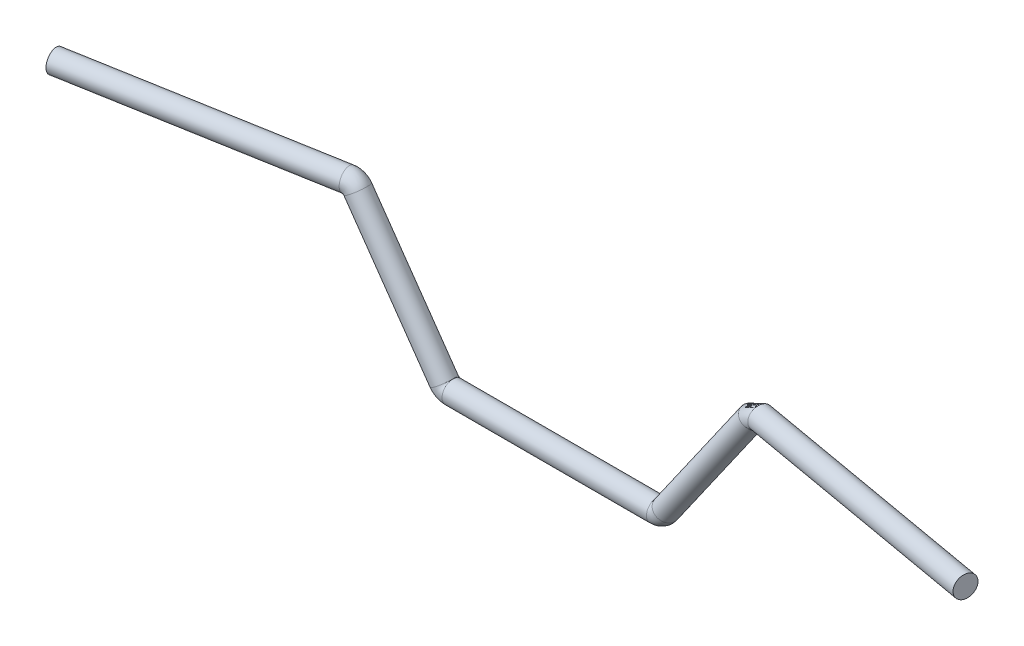
ISO-10303-21;
HEADER;
FILE_DESCRIPTION(('STEP AP214'),'2;1');
FILE_NAME('part.step','',(''),(''),'','','');
FILE_SCHEMA(('AUTOMOTIVE_DESIGN { 1 0 10303 214 1 1 1 1 }'));
ENDSEC;
DATA;
#1=APPLICATION_CONTEXT('core data for automotive mechanical design processes');
#2=APPLICATION_PROTOCOL_DEFINITION('international standard','automotive_design',2000,#1);
#3=PRODUCT_CONTEXT('',#1,'mechanical');
#4=PRODUCT('Part','Part','',(#3));
#5=PRODUCT_RELATED_PRODUCT_CATEGORY('part','',(#4));
#6=PRODUCT_DEFINITION_FORMATION('','',#4);
#7=PRODUCT_DEFINITION_CONTEXT('part definition',#1,'design');
#8=PRODUCT_DEFINITION('design','',#6,#7);
#9=PRODUCT_DEFINITION_SHAPE('','',#8);
#10=(LENGTH_UNIT() NAMED_UNIT(*) SI_UNIT(.MILLI.,.METRE.));
#11=(NAMED_UNIT(*) PLANE_ANGLE_UNIT() SI_UNIT($,.RADIAN.));
#12=(NAMED_UNIT(*) SI_UNIT($,.STERADIAN.) SOLID_ANGLE_UNIT());
#13=UNCERTAINTY_MEASURE_WITH_UNIT(LENGTH_MEASURE(1.E-05),#10,'distance_accuracy_value','');
#14=(GEOMETRIC_REPRESENTATION_CONTEXT(3) GLOBAL_UNCERTAINTY_ASSIGNED_CONTEXT((#13)) GLOBAL_UNIT_ASSIGNED_CONTEXT((#10,
#11,#12)) REPRESENTATION_CONTEXT('',''));
#15=CARTESIAN_POINT('',(0.,0.,0.));
#16=DIRECTION('',(0.,0.,1.));
#17=DIRECTION('',(1.,0.,0.));
#18=AXIS2_PLACEMENT_3D('',#15,#16,#17);
#19=CARTESIAN_POINT('',(422.390326175586,122.872806643351,41.6755626400692));
#20=DIRECTION('',(0.984807753012204,0.,0.173648177666956));
#21=DIRECTION('',(0.173648177666956,0.,-0.984807753012203));
#22=AXIS2_PLACEMENT_3D('',#19,#20,#21);
#23=PLANE('',#22);
#24=CARTESIAN_POINT('',(422.390326175586,122.872806643351,41.6755626400692));
#25=DIRECTION('',(0.984807753012204,0.,0.173648177666956));
#26=DIRECTION('',(0.173648177666956,0.,-0.984807753012203));
#27=AXIS2_PLACEMENT_3D('',#24,#25,#26);
#28=CIRCLE('',#27,10.);
#29=CARTESIAN_POINT('',(424.126807952255,122.872806643351,31.8274851099472));
#30=VERTEX_POINT('',#29);
#31=EDGE_CURVE('E58',#30,#30,#28,.T.);
#32=ORIENTED_EDGE('',*,*,#31,.T.);
#33=EDGE_LOOP('',(#32));
#34=FACE_BOUND('',#33,.T.);
#35=ADVANCED_FACE('F46',(#34),#23,.T.);
#36=CARTESIAN_POINT('',(-422.390326175587,122.872806643349,41.6755626400633));
#37=DIRECTION('',(0.984807753012208,0.,-0.17364817766693));
#38=DIRECTION('',(-0.17364817766693,0.,-0.984807753012208));
#39=AXIS2_PLACEMENT_3D('',#36,#37,#38);
#40=PLANE('',#39);
#41=CARTESIAN_POINT('',(-422.390326175587,122.872806643349,41.6755626400633));
#42=DIRECTION('',(0.984807753012208,0.,-0.17364817766693));
#43=DIRECTION('',(-0.17364817766693,0.,-0.984807753012208));
#44=AXIS2_PLACEMENT_3D('',#41,#42,#43);
#45=CIRCLE('',#44,10.);
#46=CARTESIAN_POINT('',(-424.126807952257,122.872806643349,31.8274851099412));
#47=VERTEX_POINT('',#46);
#48=EDGE_CURVE('E12',#47,#47,#45,.T.);
#49=ORIENTED_EDGE('',*,*,#48,.F.);
#50=EDGE_LOOP('',(#49));
#51=FACE_BOUND('',#50,.T.);
#52=ADVANCED_FACE('F102',(#51),#40,.F.);
#53=CARTESIAN_POINT('',(422.390326175586,122.872806643351,41.6755626400692));
#54=DIRECTION('',(-0.984807753012204,0.,-0.173648177666956));
#55=DIRECTION('',(-0.173648177666956,0.,0.984807753012204));
#56=AXIS2_PLACEMENT_3D('',#53,#54,#55);
#57=CYLINDRICAL_SURFACE('',#56,10.);
#58=CARTESIAN_POINT('',(191.229564545639,122.87280664335,0.915683483585339));
#59=DIRECTION('',(0.984807753012204,0.,0.173648177666956));
#60=DIRECTION('',(0.173648177666956,0.,-0.984807753012203));
#61=AXIS2_PLACEMENT_3D('',#58,#59,#60);
#62=CIRCLE('',#61,10.);
#63=CARTESIAN_POINT('',(191.019969785401,112.945917331919,2.10435443682254));
#64=VERTEX_POINT('',#63);
#65=EDGE_CURVE('E97',#64,#64,#62,.T.);
#66=ORIENTED_EDGE('',*,*,#65,.T.);
#67=EDGE_LOOP('',(#66));
#68=FACE_BOUND('',#67,.T.);
#69=ORIENTED_EDGE('',*,*,#31,.F.);
#70=EDGE_LOOP('',(#69));
#71=FACE_BOUND('',#70,.T.);
#72=ADVANCED_FACE('F106',(#68,#71),#57,.T.);
#73=CARTESIAN_POINT('',(191.019969785401,112.945917331919,2.10435443682254));
#74=DIRECTION('',(-0.172378623883165,0.120700811869206,0.977607755719164));
#75=DIRECTION('',(0.984807753012204,0.,0.173648177666956));
#76=AXIS2_PLACEMENT_3D('',#73,#74,#75);
#77=TOROIDAL_SURFACE('',#76,10.,10.);
#78=CARTESIAN_POINT('',(183.011875869299,118.553245058664,1.73472347597681E-13));
#79=DIRECTION('',(0.573576436351043,0.819152044288994,0.));
#80=DIRECTION('',(0.074460008174665,-0.0521374590190554,-0.995860127000607));
#81=AXIS2_PLACEMENT_3D('',#78,#79,#80);
#82=CIRCLE('',#81,10.);
#83=EDGE_CURVE('E94',#64,#64,#82,.T.);
#84=ORIENTED_EDGE('',*,*,#83,.T.);
#85=ORIENTED_EDGE('',*,*,#65,.F.);
#86=EDGE_LOOP('',(#84,#85));
#87=FACE_BOUND('',#86,.T.);
#88=ADVANCED_FACE('F135',(#87),#77,.T.);
#89=CARTESIAN_POINT('',(183.011875869299,118.553245058664,0.));
#90=DIRECTION('',(-0.573576436351044,-0.819152044288993,0.));
#91=DIRECTION('',(0.819152044288993,-0.573576436351044,0.));
#92=AXIS2_PLACEMENT_3D('',#89,#90,#91);
#93=CYLINDRICAL_SURFACE('',#92,10.);
#94=CARTESIAN_POINT('',(102.985849937372,4.26423563648953,0.));
#95=DIRECTION('',(0.573576436351044,0.819152044288993,0.));
#96=DIRECTION('',(0.0744600081746643,-0.0521374590190564,-0.995860127000607));
#97=AXIS2_PLACEMENT_3D('',#94,#95,#96);
#98=CIRCLE('',#97,10.);
#99=CARTESIAN_POINT('',(94.7943294944826,10.,0.));
#100=VERTEX_POINT('',#99);
#101=EDGE_CURVE('E91',#100,#100,#98,.T.);
#102=ORIENTED_EDGE('',*,*,#101,.T.);
#103=EDGE_LOOP('',(#102));
#104=FACE_BOUND('',#103,.T.);
#105=ORIENTED_EDGE('',*,*,#83,.F.);
#106=EDGE_LOOP('',(#105));
#107=FACE_BOUND('',#106,.T.);
#108=ADVANCED_FACE('F131',(#104,#107),#93,.T.);
#109=CARTESIAN_POINT('',(84.7943294944826,10.,0.));
#110=DIRECTION('',(0.,-1.,0.));
#111=DIRECTION('',(-1.,0.,0.));
#112=AXIS2_PLACEMENT_3D('',#109,#110,#111);
#113=CIRCLE('',#112,10.);
#114=TRIMMED_CURVE('',#113,(PARAMETER_VALUE(-3.14159257062364)),
(PARAMETER_VALUE(3.14159257062364)),.T.,.PARAMETER.);
#115=CARTESIAN_POINT('',(94.7943294944826,10.,0.));
#116=DIRECTION('',(0.,0.,-1.));
#117=AXIS1_PLACEMENT('',#115,#116);
#118=SURFACE_OF_REVOLUTION('',#114,#117);
#119=CARTESIAN_POINT('',(94.7943294944825,0.,0.));
#120=DIRECTION('',(1.,0.,0.));
#121=DIRECTION('',(0.,-0.0908988858586004,-0.995860127000607));
#122=AXIS2_PLACEMENT_3D('',#119,#120,#121);
#123=CIRCLE('',#122,10.);
#124=EDGE_CURVE('E88',#100,#100,#123,.T.);
#125=ORIENTED_EDGE('',*,*,#124,.T.);
#126=ORIENTED_EDGE('',*,*,#101,.F.);
#127=EDGE_LOOP('',(#125,#126));
#128=FACE_BOUND('',#127,.T.);
#129=ADVANCED_FACE('F127',(#128),#118,.T.);
#130=CARTESIAN_POINT('',(94.7943294944825,0.,0.));
#131=DIRECTION('',(-1.,0.,0.));
#132=DIRECTION('',(0.,0.,1.));
#133=AXIS2_PLACEMENT_3D('',#130,#131,#132);
#134=CYLINDRICAL_SURFACE('',#133,10.);
#135=CARTESIAN_POINT('',(-94.7943294944825,0.,0.));
#136=DIRECTION('',(1.,0.,0.));
#137=DIRECTION('',(0.,-0.0908988858586004,-0.995860127000607));
#138=AXIS2_PLACEMENT_3D('',#135,#136,#137);
#139=CIRCLE('',#138,10.);
#140=CARTESIAN_POINT('',(-94.7943294944826,10.,0.));
#141=VERTEX_POINT('',#140);
#142=EDGE_CURVE('E83',#141,#141,#139,.T.);
#143=ORIENTED_EDGE('',*,*,#142,.T.);
#144=EDGE_LOOP('',(#143));
#145=FACE_BOUND('',#144,.T.);
#146=ORIENTED_EDGE('',*,*,#124,.F.);
#147=EDGE_LOOP('',(#146));
#148=FACE_BOUND('',#147,.T.);
#149=ADVANCED_FACE('F123',(#145,#148),#134,.T.);
#150=CARTESIAN_POINT('',(-104.794329494483,10.,0.));
#151=DIRECTION('',(0.,-1.,0.));
#152=DIRECTION('',(-1.,0.,0.));
#153=AXIS2_PLACEMENT_3D('',#150,#151,#152);
#154=CIRCLE('',#153,10.);
#155=TRIMMED_CURVE('',#154,(PARAMETER_VALUE(-3.14159257616109)),
(PARAMETER_VALUE(3.14159257616109)),.T.,.PARAMETER.);
#156=CARTESIAN_POINT('',(-94.7943294944826,10.,0.));
#157=DIRECTION('',(0.,0.,-1.));
#158=AXIS1_PLACEMENT('',#156,#157);
#159=SURFACE_OF_REVOLUTION('',#155,#158);
#160=CARTESIAN_POINT('',(-102.985849937372,4.26423563648948,0.));
#161=DIRECTION('',(0.573576436351052,-0.819152044288988,0.));
#162=DIRECTION('',(-0.0744600081746639,-0.052137459019057,-0.995860127000607));
#163=AXIS2_PLACEMENT_3D('',#160,#161,#162);
#164=CIRCLE('',#163,10.);
#165=EDGE_CURVE('E80',#141,#141,#164,.T.);
#166=ORIENTED_EDGE('',*,*,#165,.T.);
#167=ORIENTED_EDGE('',*,*,#142,.F.);
#168=EDGE_LOOP('',(#166,#167));
#169=FACE_BOUND('',#168,.T.);
#170=ADVANCED_FACE('F120',(#169),#159,.T.);
#171=CARTESIAN_POINT('',(-102.985849937372,4.26423563648953,0.));
#172=DIRECTION('',(-0.57357643635105,0.819152044288989,0.));
#173=DIRECTION('',(-0.819152044288989,-0.57357643635105,0.));
#174=AXIS2_PLACEMENT_3D('',#171,#172,#173);
#175=CYLINDRICAL_SURFACE('',#174,10.);
#176=CARTESIAN_POINT('',(-183.0118758693,118.553245058663,0.));
#177=DIRECTION('',(0.57357643635105,-0.819152044288989,0.));
#178=DIRECTION('',(-0.074460008174664,-0.0521374590190569,-0.995860127000607));
#179=AXIS2_PLACEMENT_3D('',#176,#177,#178);
#180=CIRCLE('',#179,10.);
#181=CARTESIAN_POINT('',(-191.019969785401,112.945917331918,2.10435443682222));
#182=VERTEX_POINT('',#181);
#183=EDGE_CURVE('E76',#182,#182,#180,.T.);
#184=ORIENTED_EDGE('',*,*,#183,.T.);
#185=EDGE_LOOP('',(#184));
#186=FACE_BOUND('',#185,.T.);
#187=ORIENTED_EDGE('',*,*,#165,.F.);
#188=EDGE_LOOP('',(#187));
#189=FACE_BOUND('',#188,.T.);
#190=ADVANCED_FACE('F114',(#186,#189),#175,.T.);
#191=CARTESIAN_POINT('',(-181.171892255279,112.945917331918,0.367872660152921));
#192=DIRECTION('',(0.0209594760240044,-0.992688931143144,0.118867095323649));
#193=DIRECTION('',(0.984807753012208,0.,-0.173648177666931));
#194=AXIS2_PLACEMENT_3D('',#191,#192,#193);
#195=CIRCLE('',#194,10.);
#196=TRIMMED_CURVE('',#195,(PARAMETER_VALUE(-3.14159254010593)),
(PARAMETER_VALUE(3.14159254010593)),.T.,.PARAMETER.);
#197=CARTESIAN_POINT('',(-191.019969785401,112.945917331918,2.10435443682222));
#198=DIRECTION('',(0.172378623883141,0.120700811869193,0.97760775571917));
#199=AXIS1_PLACEMENT('',#197,#198);
#200=SURFACE_OF_REVOLUTION('',#196,#199);
#201=CARTESIAN_POINT('',(-191.229564545654,122.872806643299,0.91568348359377));
#202=DIRECTION('',(0.984807753012208,0.,-0.17364817766693));
#203=DIRECTION('',(-0.17364817766693,0.,-0.984807753012208));
#204=AXIS2_PLACEMENT_3D('',#201,#202,#203);
#205=CIRCLE('',#204,10.);
#206=EDGE_CURVE('E53',#182,#182,#205,.T.);
#207=ORIENTED_EDGE('',*,*,#206,.T.);
#208=ORIENTED_EDGE('',*,*,#183,.F.);
#209=EDGE_LOOP('',(#207,#208));
#210=FACE_BOUND('',#209,.T.);
#211=ADVANCED_FACE('F77',(#210),#200,.T.);
#212=CARTESIAN_POINT('',(-191.22956454564,122.872806643349,0.91568348358545));
#213=DIRECTION('',(-0.984807753012208,0.,0.17364817766693));
#214=DIRECTION('',(0.17364817766693,0.,0.984807753012208));
#215=AXIS2_PLACEMENT_3D('',#212,#213,#214);
#216=CYLINDRICAL_SURFACE('',#215,10.);
#217=ORIENTED_EDGE('',*,*,#48,.T.);
#218=EDGE_LOOP('',(#217));
#219=FACE_BOUND('',#218,.T.);
#220=ORIENTED_EDGE('',*,*,#206,.F.);
#221=EDGE_LOOP('',(#220));
#222=FACE_BOUND('',#221,.T.);
#223=ADVANCED_FACE('F108',(#219,#222),#216,.T.);
#224=CLOSED_SHELL('',(#35,#52,#72,#88,#108,#129,#149,#170,#190,#211,#223));
#225=MANIFOLD_SOLID_BREP('B2',#224);
#226=ADVANCED_BREP_SHAPE_REPRESENTATION('',(#18,#225),#14);
#227=SHAPE_DEFINITION_REPRESENTATION(#9,#226);
ENDSEC;
END-ISO-10303-21;
